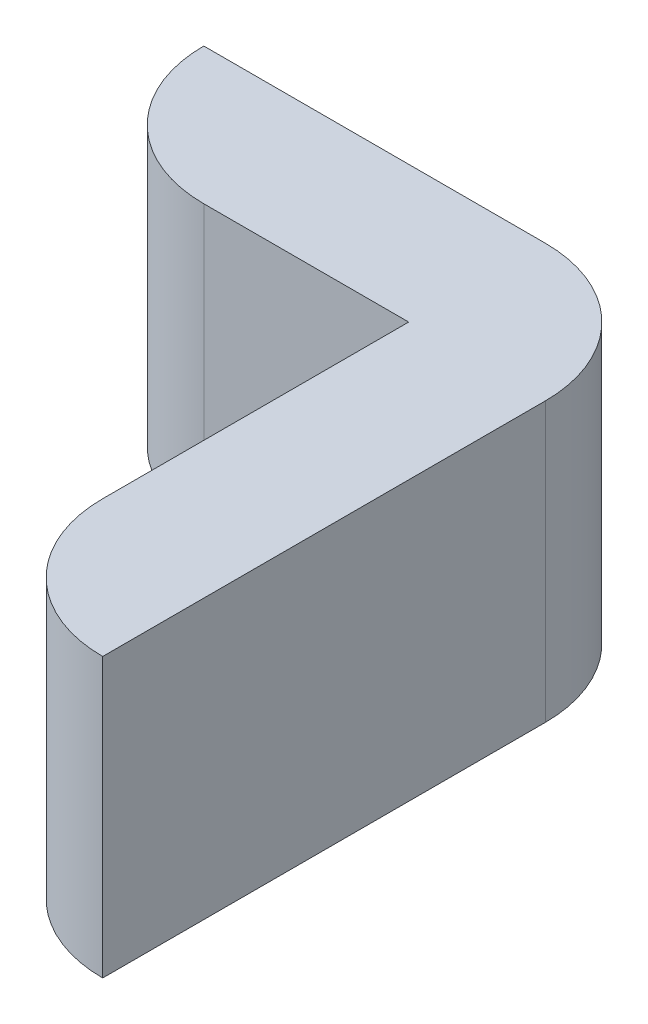
ISO-10303-21;
HEADER;
FILE_DESCRIPTION(('STEP AP214'),'2;1');
FILE_NAME('part.step','',(''),(''),'','','');
FILE_SCHEMA(('AUTOMOTIVE_DESIGN { 1 0 10303 214 1 1 1 1 }'));
ENDSEC;
DATA;
#1=APPLICATION_CONTEXT('core data for automotive mechanical design processes');
#2=APPLICATION_PROTOCOL_DEFINITION('international standard','automotive_design',2000,#1);
#3=PRODUCT_CONTEXT('',#1,'mechanical');
#4=PRODUCT('Part','Part','',(#3));
#5=PRODUCT_RELATED_PRODUCT_CATEGORY('part','',(#4));
#6=PRODUCT_DEFINITION_FORMATION('','',#4);
#7=PRODUCT_DEFINITION_CONTEXT('part definition',#1,'design');
#8=PRODUCT_DEFINITION('design','',#6,#7);
#9=PRODUCT_DEFINITION_SHAPE('','',#8);
#10=(LENGTH_UNIT() NAMED_UNIT(*) SI_UNIT(.MILLI.,.METRE.));
#11=(NAMED_UNIT(*) PLANE_ANGLE_UNIT() SI_UNIT($,.RADIAN.));
#12=(NAMED_UNIT(*) SI_UNIT($,.STERADIAN.) SOLID_ANGLE_UNIT());
#13=UNCERTAINTY_MEASURE_WITH_UNIT(LENGTH_MEASURE(1.E-05),#10,'distance_accuracy_value','');
#14=(GEOMETRIC_REPRESENTATION_CONTEXT(3) GLOBAL_UNCERTAINTY_ASSIGNED_CONTEXT((#13)) GLOBAL_UNIT_ASSIGNED_CONTEXT((#10,
#11,#12)) REPRESENTATION_CONTEXT('',''));
#15=CARTESIAN_POINT('',(0.,0.,0.));
#16=DIRECTION('',(0.,0.,1.));
#17=DIRECTION('',(1.,0.,0.));
#18=AXIS2_PLACEMENT_3D('',#15,#16,#17);
#19=CARTESIAN_POINT('',(-0.125,0.2548,0.));
#20=DIRECTION('',(0.,-1.,0.));
#21=DIRECTION('',(0.,0.,-1.));
#22=AXIS2_PLACEMENT_3D('',#19,#20,#21);
#23=PLANE('',#22);
#24=DIRECTION('',(-1.,0.,0.));
#25=VECTOR('',#24,1.);
#26=CARTESIAN_POINT('',(0.125,0.2548,0.25));
#27=LINE('',#26,#25);
#28=CARTESIAN_POINT('',(0.125,0.2548,0.25));
#29=VERTEX_POINT('',#28);
#30=CARTESIAN_POINT('',(0.5,0.2548,0.25));
#31=VERTEX_POINT('',#30);
#32=EDGE_CURVE('E103',#29,#31,#27,.F.);
#33=ORIENTED_EDGE('',*,*,#32,.T.);
#34=DIRECTION('',(0.,0.,-1.));
#35=VECTOR('',#34,1.);
#36=CARTESIAN_POINT('',(0.5,0.2548,0.25));
#37=LINE('',#36,#35);
#38=CARTESIAN_POINT('',(0.5,0.2548,0.81));
#39=VERTEX_POINT('',#38);
#40=EDGE_CURVE('E109',#31,#39,#37,.F.);
#41=ORIENTED_EDGE('',*,*,#40,.T.);
#42=CARTESIAN_POINT('',(0.75,0.2548,0.81));
#43=DIRECTION('',(0.,-1.,0.));
#44=DIRECTION('',(0.,0.,-1.));
#45=AXIS2_PLACEMENT_3D('',#42,#43,#44);
#46=CIRCLE('',#45,0.25);
#47=CARTESIAN_POINT('',(0.75,0.2548,1.06));
#48=VERTEX_POINT('',#47);
#49=EDGE_CURVE('E81',#48,#39,#46,.T.);
#50=ORIENTED_EDGE('',*,*,#49,.F.);
#51=DIRECTION('',(0.,0.,1.));
#52=VECTOR('',#51,1.);
#53=CARTESIAN_POINT('',(0.75,0.2548,1.06));
#54=LINE('',#53,#52);
#55=CARTESIAN_POINT('',(0.75,0.2548,0.25));
#56=VERTEX_POINT('',#55);
#57=EDGE_CURVE('E76',#48,#56,#54,.F.);
#58=ORIENTED_EDGE('',*,*,#57,.T.);
#59=CARTESIAN_POINT('',(0.5,0.2548,0.25));
#60=DIRECTION('',(0.,-1.,0.));
#61=DIRECTION('',(0.,0.,-1.));
#62=AXIS2_PLACEMENT_3D('',#59,#60,#61);
#63=CIRCLE('',#62,0.25);
#64=CARTESIAN_POINT('',(0.5,0.2548,0.));
#65=VERTEX_POINT('',#64);
#66=EDGE_CURVE('E20',#65,#56,#63,.T.);
#67=ORIENTED_EDGE('',*,*,#66,.F.);
#68=DIRECTION('',(1.,0.,0.));
#69=VECTOR('',#68,1.);
#70=CARTESIAN_POINT('',(0.5,0.2548,0.));
#71=LINE('',#70,#69);
#72=CARTESIAN_POINT('',(-0.125,0.2548,0.));
#73=VERTEX_POINT('',#72);
#74=EDGE_CURVE('E71',#65,#73,#71,.F.);
#75=ORIENTED_EDGE('',*,*,#74,.T.);
#76=CARTESIAN_POINT('',(0.125,0.2548,0.));
#77=DIRECTION('',(0.,-1.,0.));
#78=DIRECTION('',(0.,0.,-1.));
#79=AXIS2_PLACEMENT_3D('',#76,#77,#78);
#80=CIRCLE('',#79,0.25);
#81=EDGE_CURVE('E122',#29,#73,#80,.T.);
#82=ORIENTED_EDGE('',*,*,#81,.F.);
#83=EDGE_LOOP('',(#33,#41,#50,#58,#67,#75,#82));
#84=FACE_BOUND('',#83,.T.);
#85=ADVANCED_FACE('F17',(#84),#23,.F.);
#86=CARTESIAN_POINT('',(0.5,-0.2548,0.));
#87=DIRECTION('',(0.,0.,1.));
#88=DIRECTION('',(1.,0.,0.));
#89=AXIS2_PLACEMENT_3D('',#86,#87,#88);
#90=PLANE('',#89);
#91=DIRECTION('',(0.,-1.,0.));
#92=VECTOR('',#91,1.);
#93=CARTESIAN_POINT('',(-0.125,-0.2548,0.));
#94=LINE('',#93,#92);
#95=CARTESIAN_POINT('',(-0.125,-0.2548,0.));
#96=VERTEX_POINT('',#95);
#97=EDGE_CURVE('E124',#73,#96,#94,.T.);
#98=ORIENTED_EDGE('',*,*,#97,.F.);
#99=ORIENTED_EDGE('',*,*,#74,.F.);
#100=DIRECTION('',(0.,-1.,0.));
#101=VECTOR('',#100,1.);
#102=CARTESIAN_POINT('',(0.5,-0.2548,0.));
#103=LINE('',#102,#101);
#104=CARTESIAN_POINT('',(0.5,-0.2548,0.));
#105=VERTEX_POINT('',#104);
#106=EDGE_CURVE('E93',#105,#65,#103,.F.);
#107=ORIENTED_EDGE('',*,*,#106,.F.);
#108=DIRECTION('',(1.,0.,0.));
#109=VECTOR('',#108,1.);
#110=CARTESIAN_POINT('',(-0.125,-0.2548,0.));
#111=LINE('',#110,#109);
#112=EDGE_CURVE('E121',#96,#105,#111,.T.);
#113=ORIENTED_EDGE('',*,*,#112,.F.);
#114=EDGE_LOOP('',(#98,#99,#107,#113));
#115=FACE_BOUND('',#114,.T.);
#116=ADVANCED_FACE('F159',(#115),#90,.F.);
#117=CARTESIAN_POINT('',(0.5,-0.2548,0.25));
#118=DIRECTION('',(0.,-1.,0.));
#119=DIRECTION('',(0.,0.,-1.));
#120=AXIS2_PLACEMENT_3D('',#117,#118,#119);
#121=CYLINDRICAL_SURFACE('',#120,0.25);
#122=ORIENTED_EDGE('',*,*,#66,.T.);
#123=DIRECTION('',(0.,1.,0.));
#124=VECTOR('',#123,1.);
#125=CARTESIAN_POINT('',(0.75,-0.2548,0.25));
#126=LINE('',#125,#124);
#127=CARTESIAN_POINT('',(0.75,-0.2548,0.25));
#128=VERTEX_POINT('',#127);
#129=EDGE_CURVE('E87',#56,#128,#126,.F.);
#130=ORIENTED_EDGE('',*,*,#129,.T.);
#131=CARTESIAN_POINT('',(0.5,-0.2548,0.25));
#132=DIRECTION('',(0.,-1.,0.));
#133=DIRECTION('',(0.,0.,-1.));
#134=AXIS2_PLACEMENT_3D('',#131,#132,#133);
#135=CIRCLE('',#134,0.25);
#136=EDGE_CURVE('E119',#105,#128,#135,.T.);
#137=ORIENTED_EDGE('',*,*,#136,.F.);
#138=ORIENTED_EDGE('',*,*,#106,.T.);
#139=EDGE_LOOP('',(#122,#130,#137,#138));
#140=FACE_BOUND('',#139,.T.);
#141=ADVANCED_FACE('F90',(#140),#121,.T.);
#142=CARTESIAN_POINT('',(0.75,-0.2548,1.06));
#143=DIRECTION('',(-1.,0.,0.));
#144=DIRECTION('',(0.,0.,1.));
#145=AXIS2_PLACEMENT_3D('',#142,#143,#144);
#146=PLANE('',#145);
#147=DIRECTION('',(0.,-1.,0.));
#148=VECTOR('',#147,1.);
#149=CARTESIAN_POINT('',(0.75,-0.2548,1.06));
#150=LINE('',#149,#148);
#151=CARTESIAN_POINT('',(0.75,-0.2548,1.06));
#152=VERTEX_POINT('',#151);
#153=EDGE_CURVE('E86',#152,#48,#150,.F.);
#154=ORIENTED_EDGE('',*,*,#153,.F.);
#155=DIRECTION('',(0.,0.,-1.));
#156=VECTOR('',#155,1.);
#157=CARTESIAN_POINT('',(0.75,-0.2548,0.));
#158=LINE('',#157,#156);
#159=EDGE_CURVE('E95',#128,#152,#158,.F.);
#160=ORIENTED_EDGE('',*,*,#159,.F.);
#161=ORIENTED_EDGE('',*,*,#129,.F.);
#162=ORIENTED_EDGE('',*,*,#57,.F.);
#163=EDGE_LOOP('',(#154,#160,#161,#162));
#164=FACE_BOUND('',#163,.T.);
#165=ADVANCED_FACE('F94',(#164),#146,.F.);
#166=CARTESIAN_POINT('',(0.75,-0.2548,0.81));
#167=DIRECTION('',(0.,-1.,0.));
#168=DIRECTION('',(0.,0.,-1.));
#169=AXIS2_PLACEMENT_3D('',#166,#167,#168);
#170=CYLINDRICAL_SURFACE('',#169,0.25);
#171=ORIENTED_EDGE('',*,*,#49,.T.);
#172=DIRECTION('',(0.,1.,0.));
#173=VECTOR('',#172,1.);
#174=CARTESIAN_POINT('',(0.5,-0.2548,0.81));
#175=LINE('',#174,#173);
#176=CARTESIAN_POINT('',(0.5,-0.2548,0.81));
#177=VERTEX_POINT('',#176);
#178=EDGE_CURVE('E106',#39,#177,#175,.F.);
#179=ORIENTED_EDGE('',*,*,#178,.T.);
#180=CARTESIAN_POINT('',(0.75,-0.2548,0.81));
#181=DIRECTION('',(0.,-1.,0.));
#182=DIRECTION('',(0.,0.,-1.));
#183=AXIS2_PLACEMENT_3D('',#180,#181,#182);
#184=CIRCLE('',#183,0.25);
#185=EDGE_CURVE('E115',#152,#177,#184,.T.);
#186=ORIENTED_EDGE('',*,*,#185,.F.);
#187=ORIENTED_EDGE('',*,*,#153,.T.);
#188=EDGE_LOOP('',(#171,#179,#186,#187));
#189=FACE_BOUND('',#188,.T.);
#190=ADVANCED_FACE('F128',(#189),#170,.T.);
#191=CARTESIAN_POINT('',(0.5,-0.2548,0.25));
#192=DIRECTION('',(1.,0.,0.));
#193=DIRECTION('',(0.,0.,-1.));
#194=AXIS2_PLACEMENT_3D('',#191,#192,#193);
#195=PLANE('',#194);
#196=ORIENTED_EDGE('',*,*,#178,.F.);
#197=ORIENTED_EDGE('',*,*,#40,.F.);
#198=DIRECTION('',(0.,1.,0.));
#199=VECTOR('',#198,1.);
#200=CARTESIAN_POINT('',(0.5,-0.2548,0.25));
#201=LINE('',#200,#199);
#202=CARTESIAN_POINT('',(0.5,-0.2548,0.25));
#203=VERTEX_POINT('',#202);
#204=EDGE_CURVE('E105',#31,#203,#201,.F.);
#205=ORIENTED_EDGE('',*,*,#204,.T.);
#206=DIRECTION('',(0.,0.,-1.));
#207=VECTOR('',#206,1.);
#208=CARTESIAN_POINT('',(0.5,-0.2548,0.));
#209=LINE('',#208,#207);
#210=EDGE_CURVE('E118',#177,#203,#209,.T.);
#211=ORIENTED_EDGE('',*,*,#210,.F.);
#212=EDGE_LOOP('',(#196,#197,#205,#211));
#213=FACE_BOUND('',#212,.T.);
#214=ADVANCED_FACE('F151',(#213),#195,.F.);
#215=CARTESIAN_POINT('',(0.125,-0.2548,0.25));
#216=DIRECTION('',(0.,0.,-1.));
#217=DIRECTION('',(-1.,0.,0.));
#218=AXIS2_PLACEMENT_3D('',#215,#216,#217);
#219=PLANE('',#218);
#220=ORIENTED_EDGE('',*,*,#204,.F.);
#221=ORIENTED_EDGE('',*,*,#32,.F.);
#222=DIRECTION('',(0.,-1.,0.));
#223=VECTOR('',#222,1.);
#224=CARTESIAN_POINT('',(0.125,-0.2548,0.25));
#225=LINE('',#224,#223);
#226=CARTESIAN_POINT('',(0.125,-0.2548,0.25));
#227=VERTEX_POINT('',#226);
#228=EDGE_CURVE('E35',#227,#29,#225,.F.);
#229=ORIENTED_EDGE('',*,*,#228,.F.);
#230=DIRECTION('',(1.,0.,0.));
#231=VECTOR('',#230,1.);
#232=CARTESIAN_POINT('',(-0.125,-0.2548,0.25));
#233=LINE('',#232,#231);
#234=EDGE_CURVE('E26',#203,#227,#233,.F.);
#235=ORIENTED_EDGE('',*,*,#234,.F.);
#236=EDGE_LOOP('',(#220,#221,#229,#235));
#237=FACE_BOUND('',#236,.T.);
#238=ADVANCED_FACE('F152',(#237),#219,.F.);
#239=CARTESIAN_POINT('',(0.125,-0.2548,0.));
#240=DIRECTION('',(0.,-1.,0.));
#241=DIRECTION('',(0.,0.,-1.));
#242=AXIS2_PLACEMENT_3D('',#239,#240,#241);
#243=CYLINDRICAL_SURFACE('',#242,0.25);
#244=ORIENTED_EDGE('',*,*,#81,.T.);
#245=ORIENTED_EDGE('',*,*,#97,.T.);
#246=CARTESIAN_POINT('',(0.125,-0.2548,0.));
#247=DIRECTION('',(0.,-1.,0.));
#248=DIRECTION('',(0.,0.,-1.));
#249=AXIS2_PLACEMENT_3D('',#246,#247,#248);
#250=CIRCLE('',#249,0.25);
#251=EDGE_CURVE('E11',#227,#96,#250,.T.);
#252=ORIENTED_EDGE('',*,*,#251,.F.);
#253=ORIENTED_EDGE('',*,*,#228,.T.);
#254=EDGE_LOOP('',(#244,#245,#252,#253));
#255=FACE_BOUND('',#254,.T.);
#256=ADVANCED_FACE('F157',(#255),#243,.T.);
#257=CARTESIAN_POINT('',(-0.125,-0.2548,0.));
#258=DIRECTION('',(0.,-1.,0.));
#259=DIRECTION('',(0.,0.,-1.));
#260=AXIS2_PLACEMENT_3D('',#257,#258,#259);
#261=PLANE('',#260);
#262=ORIENTED_EDGE('',*,*,#234,.T.);
#263=ORIENTED_EDGE('',*,*,#251,.T.);
#264=ORIENTED_EDGE('',*,*,#112,.T.);
#265=ORIENTED_EDGE('',*,*,#136,.T.);
#266=ORIENTED_EDGE('',*,*,#159,.T.);
#267=ORIENTED_EDGE('',*,*,#185,.T.);
#268=ORIENTED_EDGE('',*,*,#210,.T.);
#269=EDGE_LOOP('',(#262,#263,#264,#265,#266,#267,#268));
#270=FACE_BOUND('',#269,.T.);
#271=ADVANCED_FACE('F133',(#270),#261,.T.);
#272=CLOSED_SHELL('',(#85,#116,#141,#165,#190,#214,#238,#256,#271));
#273=MANIFOLD_SOLID_BREP('B1',#272);
#274=ADVANCED_BREP_SHAPE_REPRESENTATION('',(#18,#273),#14);
#275=SHAPE_DEFINITION_REPRESENTATION(#9,#274);
ENDSEC;
END-ISO-10303-21;
